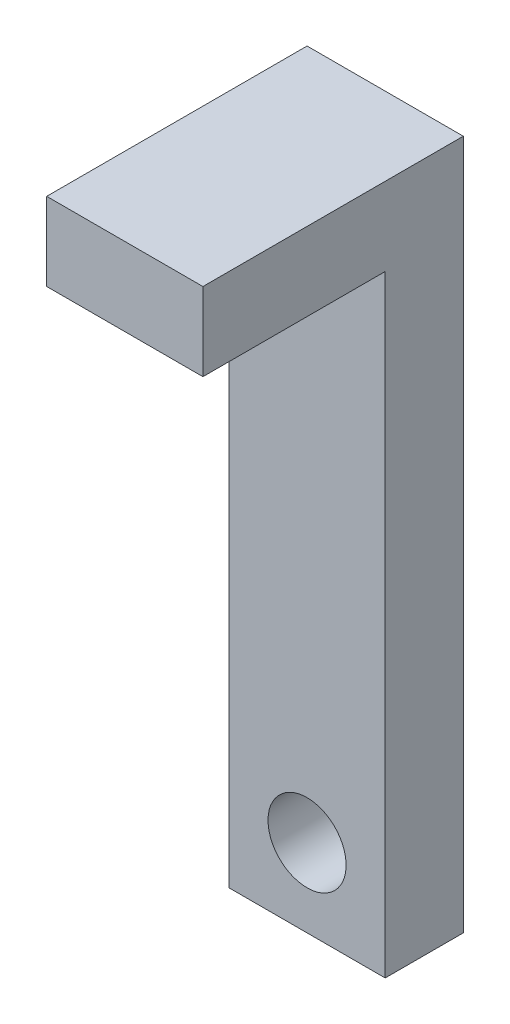
ISO-10303-21;
HEADER;
FILE_DESCRIPTION(('STEP AP214'),'2;1');
FILE_NAME('part.step','',(''),(''),'','','');
FILE_SCHEMA(('AUTOMOTIVE_DESIGN { 1 0 10303 214 1 1 1 1 }'));
ENDSEC;
DATA;
#1=APPLICATION_CONTEXT('core data for automotive mechanical design processes');
#2=APPLICATION_PROTOCOL_DEFINITION('international standard','automotive_design',2000,#1);
#3=PRODUCT_CONTEXT('',#1,'mechanical');
#4=PRODUCT('Part','Part','',(#3));
#5=PRODUCT_RELATED_PRODUCT_CATEGORY('part','',(#4));
#6=PRODUCT_DEFINITION_FORMATION('','',#4);
#7=PRODUCT_DEFINITION_CONTEXT('part definition',#1,'design');
#8=PRODUCT_DEFINITION('design','',#6,#7);
#9=PRODUCT_DEFINITION_SHAPE('','',#8);
#10=(LENGTH_UNIT() NAMED_UNIT(*) SI_UNIT(.MILLI.,.METRE.));
#11=(NAMED_UNIT(*) PLANE_ANGLE_UNIT() SI_UNIT($,.RADIAN.));
#12=(NAMED_UNIT(*) SI_UNIT($,.STERADIAN.) SOLID_ANGLE_UNIT());
#13=UNCERTAINTY_MEASURE_WITH_UNIT(LENGTH_MEASURE(1.E-05),#10,'distance_accuracy_value','');
#14=(GEOMETRIC_REPRESENTATION_CONTEXT(3) GLOBAL_UNCERTAINTY_ASSIGNED_CONTEXT((#13)) GLOBAL_UNIT_ASSIGNED_CONTEXT((#10,
#11,#12)) REPRESENTATION_CONTEXT('',''));
#15=CARTESIAN_POINT('',(0.,0.,0.));
#16=DIRECTION('',(0.,0.,1.));
#17=DIRECTION('',(1.,0.,0.));
#18=AXIS2_PLACEMENT_3D('',#15,#16,#17);
#19=CARTESIAN_POINT('',(0.,23.5,10.));
#20=DIRECTION('',(0.,1.,0.));
#21=DIRECTION('',(0.,0.,1.));
#22=AXIS2_PLACEMENT_3D('',#19,#20,#21);
#23=PLANE('',#22);
#24=DIRECTION('',(0.,0.,1.));
#25=VECTOR('',#24,1.);
#26=CARTESIAN_POINT('',(6.,23.5,3.));
#27=LINE('',#26,#25);
#28=CARTESIAN_POINT('',(6.,23.5,3.));
#29=VERTEX_POINT('',#28);
#30=CARTESIAN_POINT('',(6.,23.5,10.));
#31=VERTEX_POINT('',#30);
#32=EDGE_CURVE('E73',#29,#31,#27,.T.);
#33=ORIENTED_EDGE('',*,*,#32,.T.);
#34=DIRECTION('',(1.,0.,0.));
#35=VECTOR('',#34,1.);
#36=CARTESIAN_POINT('',(0.,23.5,10.));
#37=LINE('',#36,#35);
#38=CARTESIAN_POINT('',(0.,23.5,10.));
#39=VERTEX_POINT('',#38);
#40=EDGE_CURVE('E70',#39,#31,#37,.T.);
#41=ORIENTED_EDGE('',*,*,#40,.F.);
#42=DIRECTION('',(0.,0.,-1.));
#43=VECTOR('',#42,1.);
#44=CARTESIAN_POINT('',(0.,23.5,3.));
#45=LINE('',#44,#43);
#46=CARTESIAN_POINT('',(0.,23.5,3.));
#47=VERTEX_POINT('',#46);
#48=EDGE_CURVE('E67',#39,#47,#45,.T.);
#49=ORIENTED_EDGE('',*,*,#48,.T.);
#50=DIRECTION('',(-1.,0.,0.));
#51=VECTOR('',#50,1.);
#52=CARTESIAN_POINT('',(0.,23.5,3.));
#53=LINE('',#52,#51);
#54=EDGE_CURVE('E76',#47,#29,#53,.F.);
#55=ORIENTED_EDGE('',*,*,#54,.T.);
#56=EDGE_LOOP('',(#33,#41,#49,#55));
#57=FACE_BOUND('',#56,.T.);
#58=ADVANCED_FACE('F17',(#57),#23,.F.);
#59=CARTESIAN_POINT('',(0.,0.,10.));
#60=DIRECTION('',(0.,0.,1.));
#61=DIRECTION('',(1.,0.,0.));
#62=AXIS2_PLACEMENT_3D('',#59,#60,#61);
#63=PLANE('',#62);
#64=DIRECTION('',(0.,1.,0.));
#65=VECTOR('',#64,1.);
#66=CARTESIAN_POINT('',(6.,0.,10.));
#67=LINE('',#66,#65);
#68=CARTESIAN_POINT('',(6.,26.5,10.));
#69=VERTEX_POINT('',#68);
#70=EDGE_CURVE('E105',#31,#69,#67,.T.);
#71=ORIENTED_EDGE('',*,*,#70,.T.);
#72=DIRECTION('',(1.,0.,0.));
#73=VECTOR('',#72,1.);
#74=CARTESIAN_POINT('',(0.,26.5,10.));
#75=LINE('',#74,#73);
#76=CARTESIAN_POINT('',(0.,26.5,10.));
#77=VERTEX_POINT('',#76);
#78=EDGE_CURVE('E82',#69,#77,#75,.F.);
#79=ORIENTED_EDGE('',*,*,#78,.T.);
#80=DIRECTION('',(0.,1.,0.));
#81=VECTOR('',#80,1.);
#82=CARTESIAN_POINT('',(0.,0.,10.));
#83=LINE('',#82,#81);
#84=EDGE_CURVE('E79',#77,#39,#83,.F.);
#85=ORIENTED_EDGE('',*,*,#84,.T.);
#86=ORIENTED_EDGE('',*,*,#40,.T.);
#87=EDGE_LOOP('',(#71,#79,#85,#86));
#88=FACE_BOUND('',#87,.T.);
#89=ADVANCED_FACE('F80',(#88),#63,.T.);
#90=CARTESIAN_POINT('',(0.,0.,3.));
#91=DIRECTION('',(0.,0.,-1.));
#92=DIRECTION('',(-1.,0.,0.));
#93=AXIS2_PLACEMENT_3D('',#90,#91,#92);
#94=PLANE('',#93);
#95=DIRECTION('',(0.,1.,0.));
#96=VECTOR('',#95,1.);
#97=CARTESIAN_POINT('',(0.,0.,3.));
#98=LINE('',#97,#96);
#99=CARTESIAN_POINT('',(0.,0.,3.));
#100=VERTEX_POINT('',#99);
#101=EDGE_CURVE('E89',#47,#100,#98,.F.);
#102=ORIENTED_EDGE('',*,*,#101,.T.);
#103=DIRECTION('',(1.,0.,0.));
#104=VECTOR('',#103,1.);
#105=CARTESIAN_POINT('',(0.,0.,3.));
#106=LINE('',#105,#104);
#107=CARTESIAN_POINT('',(6.,0.,3.));
#108=VERTEX_POINT('',#107);
#109=EDGE_CURVE('E100',#100,#108,#106,.T.);
#110=ORIENTED_EDGE('',*,*,#109,.T.);
#111=DIRECTION('',(0.,1.,0.));
#112=VECTOR('',#111,1.);
#113=CARTESIAN_POINT('',(6.,0.,3.));
#114=LINE('',#113,#112);
#115=EDGE_CURVE('E96',#108,#29,#114,.T.);
#116=ORIENTED_EDGE('',*,*,#115,.T.);
#117=ORIENTED_EDGE('',*,*,#54,.F.);
#118=EDGE_LOOP('',(#102,#110,#116,#117));
#119=FACE_BOUND('',#118,.T.);
#120=CARTESIAN_POINT('',(3.,3.,3.));
#121=DIRECTION('',(0.,0.,-1.));
#122=DIRECTION('',(-1.,0.,0.));
#123=AXIS2_PLACEMENT_3D('',#120,#121,#122);
#124=CIRCLE('',#123,1.5);
#125=CARTESIAN_POINT('',(1.5,3.,3.));
#126=VERTEX_POINT('',#125);
#127=EDGE_CURVE('E20',#126,#126,#124,.T.);
#128=ORIENTED_EDGE('',*,*,#127,.T.);
#129=EDGE_LOOP('',(#128));
#130=FACE_BOUND('',#129,.T.);
#131=ADVANCED_FACE('F97',(#119,#130),#94,.F.);
#132=CARTESIAN_POINT('',(0.,0.,3.));
#133=DIRECTION('',(1.,0.,0.));
#134=DIRECTION('',(0.,0.,-1.));
#135=AXIS2_PLACEMENT_3D('',#132,#133,#134);
#136=PLANE('',#135);
#137=DIRECTION('',(0.,0.,1.));
#138=VECTOR('',#137,1.);
#139=CARTESIAN_POINT('',(0.,0.,3.));
#140=LINE('',#139,#138);
#141=CARTESIAN_POINT('',(0.,0.,0.));
#142=VERTEX_POINT('',#141);
#143=EDGE_CURVE('E131',#142,#100,#140,.T.);
#144=ORIENTED_EDGE('',*,*,#143,.T.);
#145=ORIENTED_EDGE('',*,*,#101,.F.);
#146=ORIENTED_EDGE('',*,*,#48,.F.);
#147=ORIENTED_EDGE('',*,*,#84,.F.);
#148=DIRECTION('',(0.,0.,-1.));
#149=VECTOR('',#148,1.);
#150=CARTESIAN_POINT('',(0.,26.5,3.));
#151=LINE('',#150,#149);
#152=CARTESIAN_POINT('',(0.,26.5,0.));
#153=VERTEX_POINT('',#152);
#154=EDGE_CURVE('E101',#77,#153,#151,.T.);
#155=ORIENTED_EDGE('',*,*,#154,.T.);
#156=DIRECTION('',(0.,1.,0.));
#157=VECTOR('',#156,1.);
#158=CARTESIAN_POINT('',(0.,0.,0.));
#159=LINE('',#158,#157);
#160=EDGE_CURVE('E113',#142,#153,#159,.T.);
#161=ORIENTED_EDGE('',*,*,#160,.F.);
#162=EDGE_LOOP('',(#144,#145,#146,#147,#155,#161));
#163=FACE_BOUND('',#162,.T.);
#164=ADVANCED_FACE('F88',(#163),#136,.F.);
#165=CARTESIAN_POINT('',(0.,26.5,3.));
#166=DIRECTION('',(0.,-1.,0.));
#167=DIRECTION('',(0.,0.,-1.));
#168=AXIS2_PLACEMENT_3D('',#165,#166,#167);
#169=PLANE('',#168);
#170=ORIENTED_EDGE('',*,*,#154,.F.);
#171=ORIENTED_EDGE('',*,*,#78,.F.);
#172=DIRECTION('',(0.,0.,1.));
#173=VECTOR('',#172,1.);
#174=CARTESIAN_POINT('',(6.,26.5,3.));
#175=LINE('',#174,#173);
#176=CARTESIAN_POINT('',(6.,26.5,0.));
#177=VERTEX_POINT('',#176);
#178=EDGE_CURVE('E107',#69,#177,#175,.F.);
#179=ORIENTED_EDGE('',*,*,#178,.T.);
#180=DIRECTION('',(-1.,0.,0.));
#181=VECTOR('',#180,1.);
#182=CARTESIAN_POINT('',(0.,26.5,0.));
#183=LINE('',#182,#181);
#184=EDGE_CURVE('E117',#153,#177,#183,.F.);
#185=ORIENTED_EDGE('',*,*,#184,.F.);
#186=EDGE_LOOP('',(#170,#171,#179,#185));
#187=FACE_BOUND('',#186,.T.);
#188=ADVANCED_FACE('F118',(#187),#169,.F.);
#189=CARTESIAN_POINT('',(6.,0.,3.));
#190=DIRECTION('',(-1.,0.,0.));
#191=DIRECTION('',(0.,0.,1.));
#192=AXIS2_PLACEMENT_3D('',#189,#190,#191);
#193=PLANE('',#192);
#194=ORIENTED_EDGE('',*,*,#178,.F.);
#195=ORIENTED_EDGE('',*,*,#70,.F.);
#196=ORIENTED_EDGE('',*,*,#32,.F.);
#197=ORIENTED_EDGE('',*,*,#115,.F.);
#198=DIRECTION('',(0.,0.,1.));
#199=VECTOR('',#198,1.);
#200=CARTESIAN_POINT('',(6.,0.,3.));
#201=LINE('',#200,#199);
#202=CARTESIAN_POINT('',(6.,0.,0.));
#203=VERTEX_POINT('',#202);
#204=EDGE_CURVE('E34',#108,#203,#201,.F.);
#205=ORIENTED_EDGE('',*,*,#204,.T.);
#206=DIRECTION('',(0.,1.,0.));
#207=VECTOR('',#206,1.);
#208=CARTESIAN_POINT('',(6.,0.,0.));
#209=LINE('',#208,#207);
#210=EDGE_CURVE('E121',#177,#203,#209,.F.);
#211=ORIENTED_EDGE('',*,*,#210,.F.);
#212=EDGE_LOOP('',(#194,#195,#196,#197,#205,#211));
#213=FACE_BOUND('',#212,.T.);
#214=ADVANCED_FACE('F104',(#213),#193,.F.);
#215=CARTESIAN_POINT('',(0.,0.,3.));
#216=DIRECTION('',(0.,1.,0.));
#217=DIRECTION('',(0.,0.,1.));
#218=AXIS2_PLACEMENT_3D('',#215,#216,#217);
#219=PLANE('',#218);
#220=ORIENTED_EDGE('',*,*,#204,.F.);
#221=ORIENTED_EDGE('',*,*,#109,.F.);
#222=ORIENTED_EDGE('',*,*,#143,.F.);
#223=DIRECTION('',(-1.,0.,0.));
#224=VECTOR('',#223,1.);
#225=CARTESIAN_POINT('',(0.,0.,0.));
#226=LINE('',#225,#224);
#227=EDGE_CURVE('E26',#203,#142,#226,.T.);
#228=ORIENTED_EDGE('',*,*,#227,.F.);
#229=EDGE_LOOP('',(#220,#221,#222,#228));
#230=FACE_BOUND('',#229,.T.);
#231=ADVANCED_FACE('F133',(#230),#219,.F.);
#232=CARTESIAN_POINT('',(3.,3.,3.));
#233=DIRECTION('',(0.,0.,-1.));
#234=DIRECTION('',(-1.,0.,0.));
#235=AXIS2_PLACEMENT_3D('',#232,#233,#234);
#236=CYLINDRICAL_SURFACE('',#235,1.5);
#237=ORIENTED_EDGE('',*,*,#127,.F.);
#238=EDGE_LOOP('',(#237));
#239=FACE_BOUND('',#238,.T.);
#240=CARTESIAN_POINT('',(3.,3.,0.));
#241=DIRECTION('',(0.,0.,-1.));
#242=DIRECTION('',(-1.,0.,0.));
#243=AXIS2_PLACEMENT_3D('',#240,#241,#242);
#244=CIRCLE('',#243,1.5);
#245=CARTESIAN_POINT('',(1.5,3.,0.));
#246=VERTEX_POINT('',#245);
#247=EDGE_CURVE('E11',#246,#246,#244,.F.);
#248=ORIENTED_EDGE('',*,*,#247,.F.);
#249=EDGE_LOOP('',(#248));
#250=FACE_BOUND('',#249,.T.);
#251=ADVANCED_FACE('F136',(#239,#250),#236,.F.);
#252=CARTESIAN_POINT('',(0.,0.,0.));
#253=DIRECTION('',(0.,0.,-1.));
#254=DIRECTION('',(-1.,0.,0.));
#255=AXIS2_PLACEMENT_3D('',#252,#253,#254);
#256=PLANE('',#255);
#257=ORIENTED_EDGE('',*,*,#247,.T.);
#258=EDGE_LOOP('',(#257));
#259=FACE_BOUND('',#258,.T.);
#260=ORIENTED_EDGE('',*,*,#210,.T.);
#261=ORIENTED_EDGE('',*,*,#227,.T.);
#262=ORIENTED_EDGE('',*,*,#160,.T.);
#263=ORIENTED_EDGE('',*,*,#184,.T.);
#264=EDGE_LOOP('',(#260,#261,#262,#263));
#265=FACE_BOUND('',#264,.T.);
#266=ADVANCED_FACE('F124',(#259,#265),#256,.T.);
#267=CLOSED_SHELL('',(#58,#89,#131,#164,#188,#214,#231,#251,#266));
#268=MANIFOLD_SOLID_BREP('B1',#267);
#269=ADVANCED_BREP_SHAPE_REPRESENTATION('',(#18,#268),#14);
#270=SHAPE_DEFINITION_REPRESENTATION(#9,#269);
ENDSEC;
END-ISO-10303-21;
